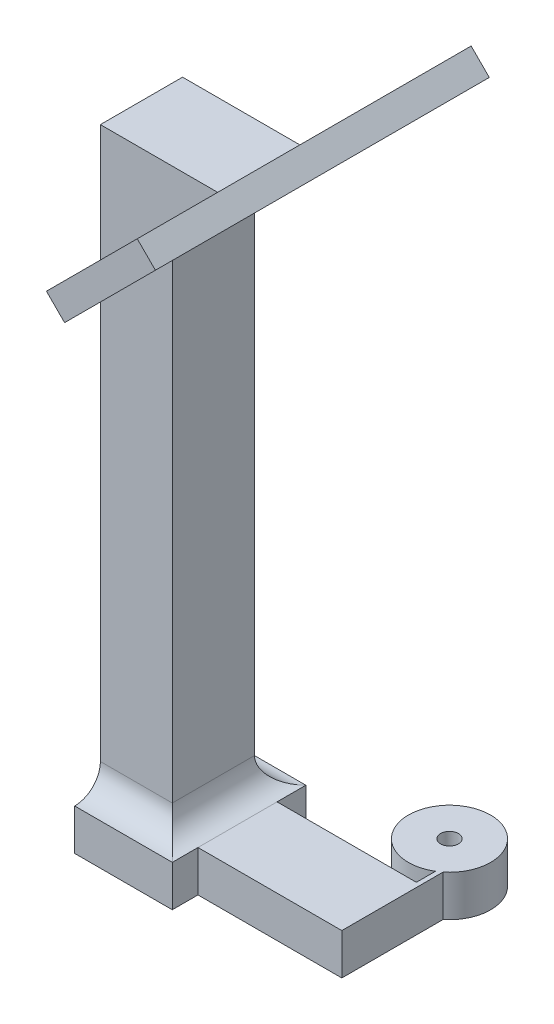
ISO-10303-21;
HEADER;
FILE_DESCRIPTION(('STEP AP214'),'2;1');
FILE_NAME('part.step','',(''),(''),'','','');
FILE_SCHEMA(('AUTOMOTIVE_DESIGN { 1 0 10303 214 1 1 1 1 }'));
ENDSEC;
DATA;
#1=APPLICATION_CONTEXT('core data for automotive mechanical design processes');
#2=APPLICATION_PROTOCOL_DEFINITION('international standard','automotive_design',2000,#1);
#3=PRODUCT_CONTEXT('',#1,'mechanical');
#4=PRODUCT('Part','Part','',(#3));
#5=PRODUCT_RELATED_PRODUCT_CATEGORY('part','',(#4));
#6=PRODUCT_DEFINITION_FORMATION('','',#4);
#7=PRODUCT_DEFINITION_CONTEXT('part definition',#1,'design');
#8=PRODUCT_DEFINITION('design','',#6,#7);
#9=PRODUCT_DEFINITION_SHAPE('','',#8);
#10=(LENGTH_UNIT() NAMED_UNIT(*) SI_UNIT(.MILLI.,.METRE.));
#11=(NAMED_UNIT(*) PLANE_ANGLE_UNIT() SI_UNIT($,.RADIAN.));
#12=(NAMED_UNIT(*) SI_UNIT($,.STERADIAN.) SOLID_ANGLE_UNIT());
#13=UNCERTAINTY_MEASURE_WITH_UNIT(LENGTH_MEASURE(1.E-05),#10,'distance_accuracy_value','');
#14=(GEOMETRIC_REPRESENTATION_CONTEXT(3) GLOBAL_UNCERTAINTY_ASSIGNED_CONTEXT((#13)) GLOBAL_UNIT_ASSIGNED_CONTEXT((#10,
#11,#12)) REPRESENTATION_CONTEXT('',''));
#15=CARTESIAN_POINT('',(0.,0.,0.));
#16=DIRECTION('',(0.,0.,1.));
#17=DIRECTION('',(1.,0.,0.));
#18=AXIS2_PLACEMENT_3D('',#15,#16,#17);
#19=CARTESIAN_POINT('',(-17.5355339059327,30.,-24.5));
#20=DIRECTION('',(0.,1.,0.));
#21=DIRECTION('',(0.,0.,1.));
#22=AXIS2_PLACEMENT_3D('',#19,#20,#21);
#23=PLANE('',#22);
#24=DIRECTION('',(0.,0.,1.));
#25=VECTOR('',#24,1.);
#26=CARTESIAN_POINT('',(-3.53553390593274,30.,-40.5));
#27=LINE('',#26,#25);
#28=CARTESIAN_POINT('',(-3.53553390593274,30.,-40.5));
#29=VERTEX_POINT('',#28);
#30=CARTESIAN_POINT('',(-3.53553390593274,30.,-24.5));
#31=VERTEX_POINT('',#30);
#32=EDGE_CURVE('E210',#29,#31,#27,.T.);
#33=ORIENTED_EDGE('',*,*,#32,.F.);
#34=DIRECTION('',(1.,0.,0.));
#35=VECTOR('',#34,1.);
#36=CARTESIAN_POINT('',(-17.5355339059327,30.,-40.5));
#37=LINE('',#36,#35);
#38=CARTESIAN_POINT('',(0.,30.,-40.5));
#39=VERTEX_POINT('',#38);
#40=EDGE_CURVE('E228',#29,#39,#37,.T.);
#41=ORIENTED_EDGE('',*,*,#40,.T.);
#42=DIRECTION('',(0.,0.,-1.));
#43=VECTOR('',#42,1.);
#44=CARTESIAN_POINT('',(0.,30.,-24.5));
#45=LINE('',#44,#43);
#46=CARTESIAN_POINT('',(0.,30.,-24.5));
#47=VERTEX_POINT('',#46);
#48=EDGE_CURVE('E251',#47,#39,#45,.T.);
#49=ORIENTED_EDGE('',*,*,#48,.F.);
#50=DIRECTION('',(1.,0.,0.));
#51=VECTOR('',#50,1.);
#52=CARTESIAN_POINT('',(-17.5355339059327,30.,-24.5));
#53=LINE('',#52,#51);
#54=EDGE_CURVE('E240',#31,#47,#53,.T.);
#55=ORIENTED_EDGE('',*,*,#54,.F.);
#56=EDGE_LOOP('',(#33,#41,#49,#55));
#57=FACE_BOUND('',#56,.T.);
#58=ADVANCED_FACE('F43',(#57),#23,.F.);
#59=CARTESIAN_POINT('',(-3.53553390593273,33.5355339059327,-65.));
#60=DIRECTION('',(-0.707106781186547,-0.707106781186548,0.));
#61=DIRECTION('',(0.707106781186548,-0.707106781186547,0.));
#62=AXIS2_PLACEMENT_3D('',#59,#60,#61);
#63=PLANE('',#62);
#64=DIRECTION('',(0.,0.,1.));
#65=VECTOR('',#64,1.);
#66=CARTESIAN_POINT('',(0.,30.,-65.));
#67=LINE('',#66,#65);
#68=CARTESIAN_POINT('',(0.,30.,-65.));
#69=VERTEX_POINT('',#68);
#70=EDGE_CURVE('E289',#69,#39,#67,.T.);
#71=ORIENTED_EDGE('',*,*,#70,.T.);
#72=DIRECTION('',(0.707106781186548,-0.707106781186547,0.));
#73=VECTOR('',#72,1.);
#74=CARTESIAN_POINT('',(-3.53553390593274,33.5355339059327,-40.5));
#75=LINE('',#74,#73);
#76=CARTESIAN_POINT('',(-3.53553390593274,33.5355339059327,-40.5));
#77=VERTEX_POINT('',#76);
#78=EDGE_CURVE('E230',#77,#39,#75,.T.);
#79=ORIENTED_EDGE('',*,*,#78,.F.);
#80=DIRECTION('',(0.,0.,1.));
#81=VECTOR('',#80,1.);
#82=CARTESIAN_POINT('',(-3.53553390593273,33.5355339059327,-65.));
#83=LINE('',#82,#81);
#84=CARTESIAN_POINT('',(-3.53553390593273,33.5355339059327,-65.));
#85=VERTEX_POINT('',#84);
#86=EDGE_CURVE('E294',#85,#77,#83,.T.);
#87=ORIENTED_EDGE('',*,*,#86,.F.);
#88=DIRECTION('',(0.707106781186548,-0.707106781186547,0.));
#89=VECTOR('',#88,1.);
#90=CARTESIAN_POINT('',(-3.53553390593273,33.5355339059327,-65.));
#91=LINE('',#90,#89);
#92=EDGE_CURVE('E275',#85,#69,#91,.T.);
#93=ORIENTED_EDGE('',*,*,#92,.T.);
#94=EDGE_LOOP('',(#71,#79,#87,#93));
#95=FACE_BOUND('',#94,.T.);
#96=ADVANCED_FACE('F392',(#95),#63,.T.);
#97=CARTESIAN_POINT('',(0.,30.,-65.));
#98=DIRECTION('',(0.707106781186547,-0.707106781186548,0.));
#99=DIRECTION('',(0.707106781186548,0.707106781186547,0.));
#100=AXIS2_PLACEMENT_3D('',#97,#98,#99);
#101=PLANE('',#100);
#102=CARTESIAN_POINT('',(8.83883476483185,38.8388347648318,-10.));
#103=DIRECTION('',(0.707106781186547,-0.707106781186548,0.));
#104=DIRECTION('',(0.707106781186548,0.707106781186547,0.));
#105=AXIS2_PLACEMENT_3D('',#102,#103,#104);
#106=CIRCLE('',#105,1.75);
#107=CARTESIAN_POINT('',(10.0762716319083,40.0762716319083,-10.));
#108=VERTEX_POINT('',#107);
#109=EDGE_CURVE('E261',#108,#108,#106,.T.);
#110=ORIENTED_EDGE('',*,*,#109,.F.);
#111=EDGE_LOOP('',(#110));
#112=FACE_BOUND('',#111,.T.);
#113=CARTESIAN_POINT('',(8.83883476483184,38.8388347648318,-55.));
#114=DIRECTION('',(0.707106781186547,-0.707106781186548,0.));
#115=DIRECTION('',(0.707106781186548,0.707106781186547,0.));
#116=AXIS2_PLACEMENT_3D('',#113,#114,#115);
#117=CIRCLE('',#116,1.75);
#118=CARTESIAN_POINT('',(10.0762716319083,40.0762716319083,-55.));
#119=VERTEX_POINT('',#118);
#120=EDGE_CURVE('E257',#119,#119,#117,.T.);
#121=ORIENTED_EDGE('',*,*,#120,.F.);
#122=EDGE_LOOP('',(#121));
#123=FACE_BOUND('',#122,.T.);
#124=DIRECTION('',(0.707106781186548,0.707106781186547,0.));
#125=VECTOR('',#124,1.);
#126=CARTESIAN_POINT('',(0.,30.,0.));
#127=LINE('',#126,#125);
#128=CARTESIAN_POINT('',(0.,30.,0.));
#129=VERTEX_POINT('',#128);
#130=CARTESIAN_POINT('',(17.6776695296637,47.6776695296637,0.));
#131=VERTEX_POINT('',#130);
#132=EDGE_CURVE('E264',#129,#131,#127,.T.);
#133=ORIENTED_EDGE('',*,*,#132,.F.);
#134=EDGE_CURVE('E293',#47,#129,#67,.T.);
#135=ORIENTED_EDGE('',*,*,#134,.F.);
#136=ORIENTED_EDGE('',*,*,#48,.T.);
#137=ORIENTED_EDGE('',*,*,#70,.F.);
#138=DIRECTION('',(0.707106781186548,0.707106781186547,0.));
#139=VECTOR('',#138,1.);
#140=CARTESIAN_POINT('',(0.,30.,-65.));
#141=LINE('',#140,#139);
#142=CARTESIAN_POINT('',(17.6776695296637,47.6776695296637,-65.));
#143=VERTEX_POINT('',#142);
#144=EDGE_CURVE('E265',#69,#143,#141,.T.);
#145=ORIENTED_EDGE('',*,*,#144,.T.);
#146=DIRECTION('',(0.,0.,1.));
#147=VECTOR('',#146,1.);
#148=CARTESIAN_POINT('',(17.6776695296637,47.6776695296637,-65.));
#149=LINE('',#148,#147);
#150=EDGE_CURVE('E278',#143,#131,#149,.T.);
#151=ORIENTED_EDGE('',*,*,#150,.T.);
#152=EDGE_LOOP('',(#133,#135,#136,#137,#145,#151));
#153=FACE_BOUND('',#152,.T.);
#154=ADVANCED_FACE('F397',(#112,#123,#153),#101,.T.);
#155=DIRECTION('',(0.707106781186548,-0.707106781186547,0.));
#156=VECTOR('',#155,1.);
#157=CARTESIAN_POINT('',(-3.53553390593274,33.5355339059327,-24.5));
#158=LINE('',#157,#156);
#159=CARTESIAN_POINT('',(-3.53553390593274,33.5355339059327,-24.5));
#160=VERTEX_POINT('',#159);
#161=EDGE_CURVE('E242',#160,#47,#158,.T.);
#162=ORIENTED_EDGE('',*,*,#161,.T.);
#163=ORIENTED_EDGE('',*,*,#134,.T.);
#164=DIRECTION('',(0.707106781186548,-0.707106781186547,0.));
#165=VECTOR('',#164,1.);
#166=CARTESIAN_POINT('',(-3.53553390593273,33.5355339059327,0.));
#167=LINE('',#166,#165);
#168=CARTESIAN_POINT('',(-3.53553390593273,33.5355339059327,0.));
#169=VERTEX_POINT('',#168);
#170=EDGE_CURVE('E269',#169,#129,#167,.T.);
#171=ORIENTED_EDGE('',*,*,#170,.F.);
#172=EDGE_CURVE('E297',#160,#169,#83,.T.);
#173=ORIENTED_EDGE('',*,*,#172,.F.);
#174=EDGE_LOOP('',(#162,#163,#171,#173));
#175=FACE_BOUND('',#174,.T.);
#176=ADVANCED_FACE('F413',(#175),#63,.T.);
#177=CARTESIAN_POINT('',(14.142135623731,51.2132034355964,-65.));
#178=DIRECTION('',(-0.707106781186547,0.707106781186547,0.));
#179=DIRECTION('',(-0.707106781186548,-0.707106781186548,0.));
#180=AXIS2_PLACEMENT_3D('',#177,#178,#179);
#181=PLANE('',#180);
#182=DIRECTION('',(-0.707106781186547,-0.707106781186548,0.));
#183=VECTOR('',#182,1.);
#184=CARTESIAN_POINT('',(5.30330085889909,42.3743686707646,-24.5));
#185=LINE('',#184,#183);
#186=CARTESIAN_POINT('',(5.30330085889909,42.3743686707646,-24.5));
#187=VERTEX_POINT('',#186);
#188=EDGE_CURVE('E245',#187,#160,#185,.T.);
#189=ORIENTED_EDGE('',*,*,#188,.T.);
#190=ORIENTED_EDGE('',*,*,#172,.T.);
#191=DIRECTION('',(-0.707106781186547,-0.707106781186547,0.));
#192=VECTOR('',#191,1.);
#193=CARTESIAN_POINT('',(14.142135623731,51.2132034355964,0.));
#194=LINE('',#193,#192);
#195=CARTESIAN_POINT('',(14.142135623731,51.2132034355964,0.));
#196=VERTEX_POINT('',#195);
#197=EDGE_CURVE('E284',#196,#169,#194,.T.);
#198=ORIENTED_EDGE('',*,*,#197,.F.);
#199=DIRECTION('',(0.,0.,1.));
#200=VECTOR('',#199,1.);
#201=CARTESIAN_POINT('',(14.142135623731,51.2132034355964,-65.));
#202=LINE('',#201,#200);
#203=CARTESIAN_POINT('',(14.142135623731,51.2132034355964,-65.));
#204=VERTEX_POINT('',#203);
#205=EDGE_CURVE('E298',#204,#196,#202,.T.);
#206=ORIENTED_EDGE('',*,*,#205,.F.);
#207=DIRECTION('',(-0.707106781186547,-0.707106781186547,0.));
#208=VECTOR('',#207,1.);
#209=CARTESIAN_POINT('',(14.142135623731,51.2132034355964,-65.));
#210=LINE('',#209,#208);
#211=EDGE_CURVE('E272',#204,#85,#210,.T.);
#212=ORIENTED_EDGE('',*,*,#211,.T.);
#213=ORIENTED_EDGE('',*,*,#86,.T.);
#214=DIRECTION('',(-0.707106781186547,-0.707106781186548,0.));
#215=VECTOR('',#214,1.);
#216=CARTESIAN_POINT('',(5.30330085889909,42.3743686707646,-40.5));
#217=LINE('',#216,#215);
#218=CARTESIAN_POINT('',(5.30330085889909,42.3743686707646,-40.5));
#219=VERTEX_POINT('',#218);
#220=EDGE_CURVE('E233',#219,#77,#217,.T.);
#221=ORIENTED_EDGE('',*,*,#220,.F.);
#222=DIRECTION('',(0.,0.,-1.));
#223=VECTOR('',#222,1.);
#224=CARTESIAN_POINT('',(5.30330085889909,42.3743686707646,-24.5));
#225=LINE('',#224,#223);
#226=EDGE_CURVE('E248',#187,#219,#225,.T.);
#227=ORIENTED_EDGE('',*,*,#226,.F.);
#228=EDGE_LOOP('',(#189,#190,#198,#206,#212,#213,#221,#227));
#229=FACE_BOUND('',#228,.T.);
#230=CARTESIAN_POINT('',(5.30330085889912,42.3743686707646,-10.));
#231=DIRECTION('',(-0.707106781186547,0.707106781186547,0.));
#232=DIRECTION('',(-0.707106781186548,-0.707106781186548,0.));
#233=AXIS2_PLACEMENT_3D('',#230,#231,#232);
#234=CIRCLE('',#233,1.75);
#235=CARTESIAN_POINT('',(4.06586399182266,41.1369318036881,-10.));
#236=VERTEX_POINT('',#235);
#237=EDGE_CURVE('E260',#236,#236,#234,.T.);
#238=ORIENTED_EDGE('',*,*,#237,.F.);
#239=EDGE_LOOP('',(#238));
#240=FACE_BOUND('',#239,.T.);
#241=CARTESIAN_POINT('',(5.3033008588991,42.3743686707646,-55.));
#242=DIRECTION('',(-0.707106781186547,0.707106781186547,0.));
#243=DIRECTION('',(-0.707106781186548,-0.707106781186548,0.));
#244=AXIS2_PLACEMENT_3D('',#241,#242,#243);
#245=CIRCLE('',#244,1.75);
#246=CARTESIAN_POINT('',(4.06586399182264,41.1369318036881,-55.));
#247=VERTEX_POINT('',#246);
#248=EDGE_CURVE('E256',#247,#247,#245,.T.);
#249=ORIENTED_EDGE('',*,*,#248,.F.);
#250=EDGE_LOOP('',(#249));
#251=FACE_BOUND('',#250,.T.);
#252=ADVANCED_FACE('F387',(#229,#240,#251),#181,.T.);
#253=CARTESIAN_POINT('',(17.6776695296637,47.6776695296637,-65.));
#254=DIRECTION('',(0.707106781186549,0.707106781186546,0.));
#255=DIRECTION('',(-0.707106781186546,0.707106781186549,0.));
#256=AXIS2_PLACEMENT_3D('',#253,#254,#255);
#257=PLANE('',#256);
#258=DIRECTION('',(-0.707106781186546,0.707106781186549,0.));
#259=VECTOR('',#258,1.);
#260=CARTESIAN_POINT('',(17.6776695296637,47.6776695296637,0.));
#261=LINE('',#260,#259);
#262=EDGE_CURVE('E281',#131,#196,#261,.T.);
#263=ORIENTED_EDGE('',*,*,#262,.F.);
#264=ORIENTED_EDGE('',*,*,#150,.F.);
#265=DIRECTION('',(-0.707106781186546,0.707106781186549,0.));
#266=VECTOR('',#265,1.);
#267=CARTESIAN_POINT('',(17.6776695296637,47.6776695296637,-65.));
#268=LINE('',#267,#266);
#269=EDGE_CURVE('E268',#143,#204,#268,.T.);
#270=ORIENTED_EDGE('',*,*,#269,.T.);
#271=ORIENTED_EDGE('',*,*,#205,.T.);
#272=EDGE_LOOP('',(#263,#264,#270,#271));
#273=FACE_BOUND('',#272,.T.);
#274=ADVANCED_FACE('F406',(#273),#257,.T.);
#275=CARTESIAN_POINT('',(0.,0.,-65.));
#276=DIRECTION('',(0.,0.,1.));
#277=DIRECTION('',(1.,0.,0.));
#278=AXIS2_PLACEMENT_3D('',#275,#276,#277);
#279=PLANE('',#278);
#280=ORIENTED_EDGE('',*,*,#144,.F.);
#281=ORIENTED_EDGE('',*,*,#92,.F.);
#282=ORIENTED_EDGE('',*,*,#211,.F.);
#283=ORIENTED_EDGE('',*,*,#269,.F.);
#284=EDGE_LOOP('',(#280,#281,#282,#283));
#285=FACE_BOUND('',#284,.T.);
#286=ADVANCED_FACE('F402',(#285),#279,.F.);
#287=CARTESIAN_POINT('',(0.,0.,0.));
#288=DIRECTION('',(0.,0.,1.));
#289=DIRECTION('',(1.,0.,0.));
#290=AXIS2_PLACEMENT_3D('',#287,#288,#289);
#291=PLANE('',#290);
#292=ORIENTED_EDGE('',*,*,#132,.T.);
#293=ORIENTED_EDGE('',*,*,#262,.T.);
#294=ORIENTED_EDGE('',*,*,#197,.T.);
#295=ORIENTED_EDGE('',*,*,#170,.T.);
#296=EDGE_LOOP('',(#292,#293,#294,#295));
#297=FACE_BOUND('',#296,.T.);
#298=ADVANCED_FACE('F410',(#297),#291,.T.);
#299=CARTESIAN_POINT('',(17.6776695296637,30.,-55.));
#300=DIRECTION('',(-0.707106781186548,0.707106781186547,0.));
#301=DIRECTION('',(-0.707106781186547,-0.707106781186548,0.));
#302=AXIS2_PLACEMENT_3D('',#299,#300,#301);
#303=CYLINDRICAL_SURFACE('',#302,1.75);
#304=ORIENTED_EDGE('',*,*,#120,.T.);
#305=EDGE_LOOP('',(#304));
#306=FACE_BOUND('',#305,.T.);
#307=ORIENTED_EDGE('',*,*,#248,.T.);
#308=EDGE_LOOP('',(#307));
#309=FACE_BOUND('',#308,.T.);
#310=ADVANCED_FACE('F488',(#306,#309),#303,.F.);
#311=CARTESIAN_POINT('',(17.6776695296637,30.,-10.));
#312=DIRECTION('',(-0.707106781186548,0.707106781186547,0.));
#313=DIRECTION('',(-0.707106781186547,-0.707106781186548,0.));
#314=AXIS2_PLACEMENT_3D('',#311,#312,#313);
#315=CYLINDRICAL_SURFACE('',#314,1.75);
#316=ORIENTED_EDGE('',*,*,#109,.T.);
#317=EDGE_LOOP('',(#316));
#318=FACE_BOUND('',#317,.T.);
#319=ORIENTED_EDGE('',*,*,#237,.T.);
#320=EDGE_LOOP('',(#319));
#321=FACE_BOUND('',#320,.T.);
#322=ADVANCED_FACE('F485',(#318,#321),#315,.F.);
#323=CARTESIAN_POINT('',(5.30330085889909,42.3743686707646,-24.5));
#324=DIRECTION('',(0.,-1.,0.));
#325=DIRECTION('',(0.,0.,-1.));
#326=AXIS2_PLACEMENT_3D('',#323,#324,#325);
#327=PLANE('',#326);
#328=ORIENTED_EDGE('',*,*,#226,.T.);
#329=DIRECTION('',(-1.,0.,0.));
#330=VECTOR('',#329,1.);
#331=CARTESIAN_POINT('',(5.30330085889909,42.3743686707646,-40.5));
#332=LINE('',#331,#330);
#333=CARTESIAN_POINT('',(-17.5355339059327,42.3743686707646,-40.5));
#334=VERTEX_POINT('',#333);
#335=EDGE_CURVE('E222',#219,#334,#332,.T.);
#336=ORIENTED_EDGE('',*,*,#335,.T.);
#337=DIRECTION('',(0.,0.,-1.));
#338=VECTOR('',#337,1.);
#339=CARTESIAN_POINT('',(-17.5355339059327,42.3743686707646,-24.5));
#340=LINE('',#339,#338);
#341=CARTESIAN_POINT('',(-17.5355339059327,42.3743686707646,-24.5));
#342=VERTEX_POINT('',#341);
#343=EDGE_CURVE('E254',#342,#334,#340,.T.);
#344=ORIENTED_EDGE('',*,*,#343,.F.);
#345=DIRECTION('',(-1.,0.,0.));
#346=VECTOR('',#345,1.);
#347=CARTESIAN_POINT('',(5.30330085889909,42.3743686707646,-24.5));
#348=LINE('',#347,#346);
#349=EDGE_CURVE('E235',#187,#342,#348,.T.);
#350=ORIENTED_EDGE('',*,*,#349,.F.);
#351=EDGE_LOOP('',(#328,#336,#344,#350));
#352=FACE_BOUND('',#351,.T.);
#353=ADVANCED_FACE('F382',(#352),#327,.F.);
#354=CARTESIAN_POINT('',(-17.5355339059327,42.3743686707646,-24.5));
#355=DIRECTION('',(1.,0.,0.));
#356=DIRECTION('',(0.,1.,0.));
#357=AXIS2_PLACEMENT_3D('',#354,#355,#356);
#358=PLANE('',#357);
#359=ORIENTED_EDGE('',*,*,#343,.T.);
#360=DIRECTION('',(0.,-1.,0.));
#361=VECTOR('',#360,1.);
#362=CARTESIAN_POINT('',(-17.5355339059327,42.3743686707646,-40.5));
#363=LINE('',#362,#361);
#364=CARTESIAN_POINT('',(-17.5355339059328,-65.,-40.5));
#365=VERTEX_POINT('',#364);
#366=EDGE_CURVE('E225',#334,#365,#363,.T.);
#367=ORIENTED_EDGE('',*,*,#366,.T.);
#368=CARTESIAN_POINT('',(-17.5355339059328,-65.,-45.5));
#369=DIRECTION('',(1.,0.,0.));
#370=DIRECTION('',(0.,1.,0.));
#371=AXIS2_PLACEMENT_3D('',#368,#369,#370);
#372=CIRCLE('',#371,5.);
#373=CARTESIAN_POINT('',(-17.5355339059327,-70.,-45.5));
#374=VERTEX_POINT('',#373);
#375=EDGE_CURVE('E52',#365,#374,#372,.T.);
#376=ORIENTED_EDGE('',*,*,#375,.T.);
#377=DIRECTION('',(0.,1.,0.));
#378=VECTOR('',#377,1.);
#379=CARTESIAN_POINT('',(-17.5355339059327,-78.,-45.5));
#380=LINE('',#379,#378);
#381=CARTESIAN_POINT('',(-17.5355339059327,-78.,-45.5));
#382=VERTEX_POINT('',#381);
#383=EDGE_CURVE('E191',#382,#374,#380,.T.);
#384=ORIENTED_EDGE('',*,*,#383,.F.);
#385=DIRECTION('',(0.,0.,-1.));
#386=VECTOR('',#385,1.);
#387=CARTESIAN_POINT('',(-17.5355339059327,-78.,0.));
#388=LINE('',#387,#386);
#389=CARTESIAN_POINT('',(-17.5355339059327,-78.,-19.5));
#390=VERTEX_POINT('',#389);
#391=EDGE_CURVE('E184',#390,#382,#388,.T.);
#392=ORIENTED_EDGE('',*,*,#391,.F.);
#393=DIRECTION('',(0.,1.,0.));
#394=VECTOR('',#393,1.);
#395=CARTESIAN_POINT('',(-17.5355339059327,-78.,-19.5));
#396=LINE('',#395,#394);
#397=CARTESIAN_POINT('',(-17.5355339059327,-70.,-19.5));
#398=VERTEX_POINT('',#397);
#399=EDGE_CURVE('E188',#390,#398,#396,.T.);
#400=ORIENTED_EDGE('',*,*,#399,.T.);
#401=CARTESIAN_POINT('',(-17.5355339059328,-65.,-19.5));
#402=DIRECTION('',(1.,0.,0.));
#403=DIRECTION('',(0.,1.,0.));
#404=AXIS2_PLACEMENT_3D('',#401,#402,#403);
#405=CIRCLE('',#404,5.);
#406=CARTESIAN_POINT('',(-17.5355339059328,-65.,-24.5));
#407=VERTEX_POINT('',#406);
#408=EDGE_CURVE('E11',#398,#407,#405,.T.);
#409=ORIENTED_EDGE('',*,*,#408,.T.);
#410=DIRECTION('',(0.,-1.,0.));
#411=VECTOR('',#410,1.);
#412=CARTESIAN_POINT('',(-17.5355339059327,42.3743686707646,-24.5));
#413=LINE('',#412,#411);
#414=EDGE_CURVE('E238',#342,#407,#413,.T.);
#415=ORIENTED_EDGE('',*,*,#414,.F.);
#416=EDGE_LOOP('',(#359,#367,#376,#384,#392,#400,#409,#415));
#417=FACE_BOUND('',#416,.T.);
#418=ADVANCED_FACE('F186',(#417),#358,.F.);
#419=CARTESIAN_POINT('',(0.,0.,-24.5));
#420=DIRECTION('',(0.,0.,1.));
#421=DIRECTION('',(1.,0.,0.));
#422=AXIS2_PLACEMENT_3D('',#419,#420,#421);
#423=PLANE('',#422);
#424=ORIENTED_EDGE('',*,*,#414,.T.);
#425=DIRECTION('',(-1.,0.,0.));
#426=VECTOR('',#425,1.);
#427=CARTESIAN_POINT('',(0.,-65.,-24.5));
#428=LINE('',#427,#426);
#429=CARTESIAN_POINT('',(-3.53553390593274,-65.,-24.5));
#430=VERTEX_POINT('',#429);
#431=EDGE_CURVE('E60',#407,#430,#428,.F.);
#432=ORIENTED_EDGE('',*,*,#431,.T.);
#433=DIRECTION('',(0.,1.,0.));
#434=VECTOR('',#433,1.);
#435=CARTESIAN_POINT('',(-3.53553390593274,-70.,-24.5));
#436=LINE('',#435,#434);
#437=EDGE_CURVE('E213',#430,#31,#436,.T.);
#438=ORIENTED_EDGE('',*,*,#437,.T.);
#439=ORIENTED_EDGE('',*,*,#54,.T.);
#440=ORIENTED_EDGE('',*,*,#161,.F.);
#441=ORIENTED_EDGE('',*,*,#188,.F.);
#442=ORIENTED_EDGE('',*,*,#349,.T.);
#443=EDGE_LOOP('',(#424,#432,#438,#439,#440,#441,#442));
#444=FACE_BOUND('',#443,.T.);
#445=ADVANCED_FACE('F414',(#444),#423,.T.);
#446=CARTESIAN_POINT('',(0.,0.,-40.5));
#447=DIRECTION('',(0.,0.,1.));
#448=DIRECTION('',(1.,0.,0.));
#449=AXIS2_PLACEMENT_3D('',#446,#447,#448);
#450=PLANE('',#449);
#451=DIRECTION('',(0.,1.,0.));
#452=VECTOR('',#451,1.);
#453=CARTESIAN_POINT('',(-3.53553390593274,-70.,-40.5));
#454=LINE('',#453,#452);
#455=CARTESIAN_POINT('',(-3.53553390593274,-65.,-40.5));
#456=VERTEX_POINT('',#455);
#457=EDGE_CURVE('E220',#456,#29,#454,.T.);
#458=ORIENTED_EDGE('',*,*,#457,.F.);
#459=DIRECTION('',(1.,0.,0.));
#460=VECTOR('',#459,1.);
#461=CARTESIAN_POINT('',(-17.5355339059327,-65.,-40.5));
#462=LINE('',#461,#460);
#463=EDGE_CURVE('E306',#456,#365,#462,.F.);
#464=ORIENTED_EDGE('',*,*,#463,.T.);
#465=ORIENTED_EDGE('',*,*,#366,.F.);
#466=ORIENTED_EDGE('',*,*,#335,.F.);
#467=ORIENTED_EDGE('',*,*,#220,.T.);
#468=ORIENTED_EDGE('',*,*,#78,.T.);
#469=ORIENTED_EDGE('',*,*,#40,.F.);
#470=EDGE_LOOP('',(#458,#464,#465,#466,#467,#468,#469));
#471=FACE_BOUND('',#470,.T.);
#472=ADVANCED_FACE('F380',(#471),#450,.F.);
#473=CARTESIAN_POINT('',(-3.53553390593274,-70.,-40.5));
#474=DIRECTION('',(-1.,0.,0.));
#475=DIRECTION('',(0.,0.,1.));
#476=AXIS2_PLACEMENT_3D('',#473,#474,#475);
#477=PLANE('',#476);
#478=ORIENTED_EDGE('',*,*,#437,.F.);
#479=DIRECTION('',(0.,0.,1.));
#480=VECTOR('',#479,1.);
#481=CARTESIAN_POINT('',(-3.53553390593274,-65.,-40.5));
#482=LINE('',#481,#480);
#483=EDGE_CURVE('E309',#430,#456,#482,.F.);
#484=ORIENTED_EDGE('',*,*,#483,.T.);
#485=ORIENTED_EDGE('',*,*,#457,.T.);
#486=ORIENTED_EDGE('',*,*,#32,.T.);
#487=EDGE_LOOP('',(#478,#484,#485,#486));
#488=FACE_BOUND('',#487,.T.);
#489=ADVANCED_FACE('F419',(#488),#477,.F.);
#490=CARTESIAN_POINT('',(0.,-70.,0.));
#491=DIRECTION('',(0.,-1.,0.));
#492=DIRECTION('',(0.,0.,-1.));
#493=AXIS2_PLACEMENT_3D('',#490,#491,#492);
#494=PLANE('',#493);
#495=CARTESIAN_POINT('',(24.4658946290548,-70.,-50.4623935367041));
#496=DIRECTION('',(0.,-1.,0.));
#497=DIRECTION('',(0.,0.,-1.));
#498=AXIS2_PLACEMENT_3D('',#495,#496,#497);
#499=CIRCLE('',#498,1.75);
#500=CARTESIAN_POINT('',(24.4658946290548,-70.,-52.2123935367041));
#501=VERTEX_POINT('',#500);
#502=EDGE_CURVE('E205',#501,#501,#499,.T.);
#503=ORIENTED_EDGE('',*,*,#502,.T.);
#504=EDGE_LOOP('',(#503));
#505=FACE_BOUND('',#504,.T.);
#506=DIRECTION('',(1.,0.,0.));
#507=VECTOR('',#506,1.);
#508=CARTESIAN_POINT('',(0.,-70.,-39.88952868371));
#509=LINE('',#508,#507);
#510=CARTESIAN_POINT('',(1.46446609406726,-70.,-39.88952868371));
#511=VERTEX_POINT('',#510);
#512=CARTESIAN_POINT('',(28.5893083210539,-70.,-39.88952868371));
#513=VERTEX_POINT('',#512);
#514=EDGE_CURVE('E332',#511,#513,#509,.T.);
#515=ORIENTED_EDGE('',*,*,#514,.F.);
#516=DIRECTION('',(0.,0.,1.));
#517=VECTOR('',#516,1.);
#518=CARTESIAN_POINT('',(1.46446609406726,-70.,-24.5));
#519=LINE('',#518,#517);
#520=CARTESIAN_POINT('',(1.46446609406726,-70.,-24.5));
#521=VERTEX_POINT('',#520);
#522=EDGE_CURVE('E292',#511,#521,#519,.T.);
#523=ORIENTED_EDGE('',*,*,#522,.T.);
#524=DIRECTION('',(-1.,0.,0.));
#525=VECTOR('',#524,1.);
#526=CARTESIAN_POINT('',(0.,-70.,-24.5));
#527=LINE('',#526,#525);
#528=CARTESIAN_POINT('',(29.4658946290548,-70.,-24.5));
#529=VERTEX_POINT('',#528);
#530=EDGE_CURVE('E343',#529,#521,#527,.T.);
#531=ORIENTED_EDGE('',*,*,#530,.F.);
#532=DIRECTION('',(0.,0.,-1.));
#533=VECTOR('',#532,1.);
#534=CARTESIAN_POINT('',(29.4658946290548,-70.,0.));
#535=LINE('',#534,#533);
#536=CARTESIAN_POINT('',(29.4658946290548,-70.,-44.2173955383057));
#537=VERTEX_POINT('',#536);
#538=EDGE_CURVE('E340',#529,#537,#535,.T.);
#539=ORIENTED_EDGE('',*,*,#538,.T.);
#540=CARTESIAN_POINT('',(24.4658946290548,-70.,-50.4623935367041));
#541=DIRECTION('',(0.,-1.,0.));
#542=DIRECTION('',(0.,0.,-1.));
#543=AXIS2_PLACEMENT_3D('',#540,#541,#542);
#544=CIRCLE('',#543,8.);
#545=CARTESIAN_POINT('',(28.5893083210539,-70.,-43.6069242220157));
#546=VERTEX_POINT('',#545);
#547=EDGE_CURVE('E337',#546,#537,#544,.T.);
#548=ORIENTED_EDGE('',*,*,#547,.F.);
#549=DIRECTION('',(0.,0.,-1.));
#550=VECTOR('',#549,1.);
#551=CARTESIAN_POINT('',(28.5893083210539,-70.,0.));
#552=LINE('',#551,#550);
#553=EDGE_CURVE('E335',#513,#546,#552,.T.);
#554=ORIENTED_EDGE('',*,*,#553,.F.);
#555=EDGE_LOOP('',(#515,#523,#531,#539,#548,#554));
#556=FACE_BOUND('',#555,.T.);
#557=ADVANCED_FACE('F425',(#505,#556),#494,.F.);
#558=CARTESIAN_POINT('',(0.,-78.,-19.5));
#559=DIRECTION('',(0.,0.,-1.));
#560=DIRECTION('',(-1.,0.,0.));
#561=AXIS2_PLACEMENT_3D('',#558,#559,#560);
#562=PLANE('',#561);
#563=DIRECTION('',(-1.,0.,0.));
#564=VECTOR('',#563,1.);
#565=CARTESIAN_POINT('',(0.,-70.,-19.5));
#566=LINE('',#565,#564);
#567=CARTESIAN_POINT('',(1.46446609406726,-70.,-19.5));
#568=VERTEX_POINT('',#567);
#569=EDGE_CURVE('E209',#568,#398,#566,.T.);
#570=ORIENTED_EDGE('',*,*,#569,.T.);
#571=ORIENTED_EDGE('',*,*,#399,.F.);
#572=DIRECTION('',(-1.,0.,0.));
#573=VECTOR('',#572,1.);
#574=CARTESIAN_POINT('',(0.,-78.,-19.5));
#575=LINE('',#574,#573);
#576=CARTESIAN_POINT('',(1.46446609406726,-78.,-19.5));
#577=VERTEX_POINT('',#576);
#578=EDGE_CURVE('E195',#577,#390,#575,.T.);
#579=ORIENTED_EDGE('',*,*,#578,.F.);
#580=DIRECTION('',(0.,1.,0.));
#581=VECTOR('',#580,1.);
#582=CARTESIAN_POINT('',(1.46446609406726,-78.,-19.5));
#583=LINE('',#582,#581);
#584=EDGE_CURVE('E348',#577,#568,#583,.T.);
#585=ORIENTED_EDGE('',*,*,#584,.T.);
#586=EDGE_LOOP('',(#570,#571,#579,#585));
#587=FACE_BOUND('',#586,.T.);
#588=ADVANCED_FACE('F207',(#587),#562,.F.);
#589=CARTESIAN_POINT('',(0.,-78.,-45.5));
#590=DIRECTION('',(0.,0.,1.));
#591=DIRECTION('',(1.,0.,0.));
#592=AXIS2_PLACEMENT_3D('',#589,#590,#591);
#593=PLANE('',#592);
#594=DIRECTION('',(1.,0.,0.));
#595=VECTOR('',#594,1.);
#596=CARTESIAN_POINT('',(0.,-70.,-45.5));
#597=LINE('',#596,#595);
#598=CARTESIAN_POINT('',(1.46446609406726,-70.,-45.5));
#599=VERTEX_POINT('',#598);
#600=EDGE_CURVE('E322',#374,#599,#597,.T.);
#601=ORIENTED_EDGE('',*,*,#600,.T.);
#602=DIRECTION('',(0.,1.,0.));
#603=VECTOR('',#602,1.);
#604=CARTESIAN_POINT('',(1.46446609406726,-78.,-45.5));
#605=LINE('',#604,#603);
#606=CARTESIAN_POINT('',(1.46446609406726,-78.,-45.5));
#607=VERTEX_POINT('',#606);
#608=EDGE_CURVE('E215',#607,#599,#605,.T.);
#609=ORIENTED_EDGE('',*,*,#608,.F.);
#610=DIRECTION('',(1.,0.,0.));
#611=VECTOR('',#610,1.);
#612=CARTESIAN_POINT('',(0.,-78.,-45.5));
#613=LINE('',#612,#611);
#614=EDGE_CURVE('E194',#382,#607,#613,.T.);
#615=ORIENTED_EDGE('',*,*,#614,.F.);
#616=ORIENTED_EDGE('',*,*,#383,.T.);
#617=EDGE_LOOP('',(#601,#609,#615,#616));
#618=FACE_BOUND('',#617,.T.);
#619=ADVANCED_FACE('F373',(#618),#593,.F.);
#620=CARTESIAN_POINT('',(1.46446609406726,-78.,0.));
#621=DIRECTION('',(-1.,0.,0.));
#622=DIRECTION('',(0.,0.,1.));
#623=AXIS2_PLACEMENT_3D('',#620,#621,#622);
#624=PLANE('',#623);
#625=DIRECTION('',(0.,0.,1.));
#626=VECTOR('',#625,1.);
#627=CARTESIAN_POINT('',(1.46446609406726,-70.,0.));
#628=LINE('',#627,#626);
#629=EDGE_CURVE('E325',#599,#511,#628,.T.);
#630=ORIENTED_EDGE('',*,*,#629,.T.);
#631=DIRECTION('',(0.,1.,0.));
#632=VECTOR('',#631,1.);
#633=CARTESIAN_POINT('',(1.46446609406726,-78.,-39.88952868371));
#634=LINE('',#633,#632);
#635=CARTESIAN_POINT('',(1.46446609406726,-78.,-39.88952868371));
#636=VERTEX_POINT('',#635);
#637=EDGE_CURVE('E363',#636,#511,#634,.T.);
#638=ORIENTED_EDGE('',*,*,#637,.F.);
#639=DIRECTION('',(0.,0.,1.));
#640=VECTOR('',#639,1.);
#641=CARTESIAN_POINT('',(1.46446609406726,-78.,0.));
#642=LINE('',#641,#640);
#643=EDGE_CURVE('E371',#607,#636,#642,.T.);
#644=ORIENTED_EDGE('',*,*,#643,.F.);
#645=ORIENTED_EDGE('',*,*,#608,.T.);
#646=EDGE_LOOP('',(#630,#638,#644,#645));
#647=FACE_BOUND('',#646,.T.);
#648=ADVANCED_FACE('F369',(#647),#624,.F.);
#649=CARTESIAN_POINT('',(0.,-78.,-39.88952868371));
#650=DIRECTION('',(0.,0.,1.));
#651=DIRECTION('',(1.,0.,0.));
#652=AXIS2_PLACEMENT_3D('',#649,#650,#651);
#653=PLANE('',#652);
#654=ORIENTED_EDGE('',*,*,#514,.T.);
#655=DIRECTION('',(0.,1.,0.));
#656=VECTOR('',#655,1.);
#657=CARTESIAN_POINT('',(28.5893083210539,-78.,-39.88952868371));
#658=LINE('',#657,#656);
#659=CARTESIAN_POINT('',(28.5893083210539,-78.,-39.88952868371));
#660=VERTEX_POINT('',#659);
#661=EDGE_CURVE('E360',#660,#513,#658,.T.);
#662=ORIENTED_EDGE('',*,*,#661,.F.);
#663=DIRECTION('',(1.,0.,0.));
#664=VECTOR('',#663,1.);
#665=CARTESIAN_POINT('',(0.,-78.,-39.88952868371));
#666=LINE('',#665,#664);
#667=EDGE_CURVE('E440',#636,#660,#666,.T.);
#668=ORIENTED_EDGE('',*,*,#667,.F.);
#669=ORIENTED_EDGE('',*,*,#637,.T.);
#670=EDGE_LOOP('',(#654,#662,#668,#669));
#671=FACE_BOUND('',#670,.T.);
#672=ADVANCED_FACE('F462',(#671),#653,.F.);
#673=CARTESIAN_POINT('',(28.5893083210539,-78.,0.));
#674=DIRECTION('',(1.,0.,0.));
#675=DIRECTION('',(0.,0.,-1.));
#676=AXIS2_PLACEMENT_3D('',#673,#674,#675);
#677=PLANE('',#676);
#678=ORIENTED_EDGE('',*,*,#553,.T.);
#679=DIRECTION('',(0.,1.,0.));
#680=VECTOR('',#679,1.);
#681=CARTESIAN_POINT('',(28.5893083210539,-78.,-43.6069242220157));
#682=LINE('',#681,#680);
#683=CARTESIAN_POINT('',(28.5893083210539,-78.,-43.6069242220157));
#684=VERTEX_POINT('',#683);
#685=EDGE_CURVE('E357',#684,#546,#682,.T.);
#686=ORIENTED_EDGE('',*,*,#685,.F.);
#687=DIRECTION('',(0.,0.,-1.));
#688=VECTOR('',#687,1.);
#689=CARTESIAN_POINT('',(28.5893083210539,-78.,0.));
#690=LINE('',#689,#688);
#691=EDGE_CURVE('E441',#660,#684,#690,.T.);
#692=ORIENTED_EDGE('',*,*,#691,.F.);
#693=ORIENTED_EDGE('',*,*,#661,.T.);
#694=EDGE_LOOP('',(#678,#686,#692,#693));
#695=FACE_BOUND('',#694,.T.);
#696=ADVANCED_FACE('F460',(#695),#677,.F.);
#697=CARTESIAN_POINT('',(24.4658946290548,-78.,-50.4623935367041));
#698=DIRECTION('',(0.,1.,0.));
#699=DIRECTION('',(0.,0.,1.));
#700=AXIS2_PLACEMENT_3D('',#697,#698,#699);
#701=CYLINDRICAL_SURFACE('',#700,8.);
#702=ORIENTED_EDGE('',*,*,#547,.T.);
#703=DIRECTION('',(0.,1.,0.));
#704=VECTOR('',#703,1.);
#705=CARTESIAN_POINT('',(29.4658946290548,-78.,-44.2173955383057));
#706=LINE('',#705,#704);
#707=CARTESIAN_POINT('',(29.4658946290548,-78.,-44.2173955383057));
#708=VERTEX_POINT('',#707);
#709=EDGE_CURVE('E355',#708,#537,#706,.T.);
#710=ORIENTED_EDGE('',*,*,#709,.F.);
#711=CARTESIAN_POINT('',(24.4658946290548,-78.,-50.4623935367041));
#712=DIRECTION('',(0.,-1.,0.));
#713=DIRECTION('',(0.,0.,-1.));
#714=AXIS2_PLACEMENT_3D('',#711,#712,#713);
#715=CIRCLE('',#714,8.);
#716=EDGE_CURVE('E444',#684,#708,#715,.T.);
#717=ORIENTED_EDGE('',*,*,#716,.F.);
#718=ORIENTED_EDGE('',*,*,#685,.T.);
#719=EDGE_LOOP('',(#702,#710,#717,#718));
#720=FACE_BOUND('',#719,.T.);
#721=ADVANCED_FACE('F457',(#720),#701,.T.);
#722=CARTESIAN_POINT('',(29.4658946290548,-78.,0.));
#723=DIRECTION('',(1.,0.,0.));
#724=DIRECTION('',(0.,0.,-1.));
#725=AXIS2_PLACEMENT_3D('',#722,#723,#724);
#726=PLANE('',#725);
#727=ORIENTED_EDGE('',*,*,#538,.F.);
#728=DIRECTION('',(0.,1.,0.));
#729=VECTOR('',#728,1.);
#730=CARTESIAN_POINT('',(29.4658946290548,-78.,-24.5));
#731=LINE('',#730,#729);
#732=CARTESIAN_POINT('',(29.4658946290548,-78.,-24.5));
#733=VERTEX_POINT('',#732);
#734=EDGE_CURVE('E353',#733,#529,#731,.T.);
#735=ORIENTED_EDGE('',*,*,#734,.F.);
#736=DIRECTION('',(0.,0.,-1.));
#737=VECTOR('',#736,1.);
#738=CARTESIAN_POINT('',(29.4658946290548,-78.,0.));
#739=LINE('',#738,#737);
#740=EDGE_CURVE('E437',#733,#708,#739,.T.);
#741=ORIENTED_EDGE('',*,*,#740,.T.);
#742=ORIENTED_EDGE('',*,*,#709,.T.);
#743=EDGE_LOOP('',(#727,#735,#741,#742));
#744=FACE_BOUND('',#743,.T.);
#745=ADVANCED_FACE('F451',(#744),#726,.T.);
#746=CARTESIAN_POINT('',(0.,-78.,-24.5));
#747=DIRECTION('',(0.,0.,-1.));
#748=DIRECTION('',(-1.,0.,0.));
#749=AXIS2_PLACEMENT_3D('',#746,#747,#748);
#750=PLANE('',#749);
#751=ORIENTED_EDGE('',*,*,#530,.T.);
#752=DIRECTION('',(0.,1.,0.));
#753=VECTOR('',#752,1.);
#754=CARTESIAN_POINT('',(1.46446609406726,-78.,-24.5));
#755=LINE('',#754,#753);
#756=CARTESIAN_POINT('',(1.46446609406726,-78.,-24.5));
#757=VERTEX_POINT('',#756);
#758=EDGE_CURVE('E350',#757,#521,#755,.T.);
#759=ORIENTED_EDGE('',*,*,#758,.F.);
#760=DIRECTION('',(-1.,0.,0.));
#761=VECTOR('',#760,1.);
#762=CARTESIAN_POINT('',(0.,-78.,-24.5));
#763=LINE('',#762,#761);
#764=EDGE_CURVE('E434',#733,#757,#763,.T.);
#765=ORIENTED_EDGE('',*,*,#764,.F.);
#766=ORIENTED_EDGE('',*,*,#734,.T.);
#767=EDGE_LOOP('',(#751,#759,#765,#766));
#768=FACE_BOUND('',#767,.T.);
#769=ADVANCED_FACE('F430',(#768),#750,.F.);
#770=EDGE_CURVE('E333',#521,#568,#628,.T.);
#771=ORIENTED_EDGE('',*,*,#770,.T.);
#772=ORIENTED_EDGE('',*,*,#584,.F.);
#773=EDGE_CURVE('E201',#757,#577,#642,.T.);
#774=ORIENTED_EDGE('',*,*,#773,.F.);
#775=ORIENTED_EDGE('',*,*,#758,.T.);
#776=EDGE_LOOP('',(#771,#772,#774,#775));
#777=FACE_BOUND('',#776,.T.);
#778=ADVANCED_FACE('F433',(#777),#624,.F.);
#779=CARTESIAN_POINT('',(24.4658946290548,-78.,-50.4623935367041));
#780=DIRECTION('',(0.,1.,0.));
#781=DIRECTION('',(0.,0.,1.));
#782=AXIS2_PLACEMENT_3D('',#779,#780,#781);
#783=CYLINDRICAL_SURFACE('',#782,1.75);
#784=CARTESIAN_POINT('',(24.4658946290548,-78.,-50.4623935367041));
#785=DIRECTION('',(0.,-1.,0.));
#786=DIRECTION('',(0.,0.,-1.));
#787=AXIS2_PLACEMENT_3D('',#784,#785,#786);
#788=CIRCLE('',#787,1.75);
#789=CARTESIAN_POINT('',(24.4658946290548,-78.,-52.2123935367041));
#790=VERTEX_POINT('',#789);
#791=EDGE_CURVE('E328',#790,#790,#788,.T.);
#792=ORIENTED_EDGE('',*,*,#791,.T.);
#793=EDGE_LOOP('',(#792));
#794=FACE_BOUND('',#793,.T.);
#795=ORIENTED_EDGE('',*,*,#502,.F.);
#796=EDGE_LOOP('',(#795));
#797=FACE_BOUND('',#796,.T.);
#798=ADVANCED_FACE('F514',(#794,#797),#783,.F.);
#799=CARTESIAN_POINT('',(0.,-78.,0.));
#800=DIRECTION('',(0.,-1.,0.));
#801=DIRECTION('',(0.,0.,-1.));
#802=AXIS2_PLACEMENT_3D('',#799,#800,#801);
#803=PLANE('',#802);
#804=ORIENTED_EDGE('',*,*,#578,.T.);
#805=ORIENTED_EDGE('',*,*,#391,.T.);
#806=ORIENTED_EDGE('',*,*,#614,.T.);
#807=ORIENTED_EDGE('',*,*,#643,.T.);
#808=ORIENTED_EDGE('',*,*,#667,.T.);
#809=ORIENTED_EDGE('',*,*,#691,.T.);
#810=ORIENTED_EDGE('',*,*,#716,.T.);
#811=ORIENTED_EDGE('',*,*,#740,.F.);
#812=ORIENTED_EDGE('',*,*,#764,.T.);
#813=ORIENTED_EDGE('',*,*,#773,.T.);
#814=EDGE_LOOP('',(#804,#805,#806,#807,#808,#809,#810,#811,#812,#813));
#815=FACE_BOUND('',#814,.T.);
#816=ORIENTED_EDGE('',*,*,#791,.F.);
#817=EDGE_LOOP('',(#816));
#818=FACE_BOUND('',#817,.T.);
#819=ADVANCED_FACE('F198',(#815,#818),#803,.T.);
#820=CARTESIAN_POINT('',(0.,-65.,-19.5));
#821=DIRECTION('',(-1.,0.,0.));
#822=DIRECTION('',(0.,0.,1.));
#823=AXIS2_PLACEMENT_3D('',#820,#821,#822);
#824=CYLINDRICAL_SURFACE('',#823,5.);
#825=ORIENTED_EDGE('',*,*,#408,.F.);
#826=ORIENTED_EDGE('',*,*,#569,.F.);
#827=CARTESIAN_POINT('',(1.46446609406726,-65.,-19.5));
#828=DIRECTION('',(0.707106781186547,0.,-0.707106781186547));
#829=DIRECTION('',(-0.707106781186547,0.,-0.707106781186547));
#830=AXIS2_PLACEMENT_3D('',#827,#828,#829);
#831=ELLIPSE('',#830,7.07106781186547,5.);
#832=EDGE_CURVE('E47',#430,#568,#831,.F.);
#833=ORIENTED_EDGE('',*,*,#832,.F.);
#834=ORIENTED_EDGE('',*,*,#431,.F.);
#835=EDGE_LOOP('',(#825,#826,#833,#834));
#836=FACE_BOUND('',#835,.T.);
#837=ADVANCED_FACE('F45',(#836),#824,.F.);
#838=CARTESIAN_POINT('',(1.46446609406726,-65.,0.));
#839=DIRECTION('',(0.,0.,-1.));
#840=DIRECTION('',(-1.,0.,0.));
#841=AXIS2_PLACEMENT_3D('',#838,#839,#840);
#842=CYLINDRICAL_SURFACE('',#841,5.);
#843=ORIENTED_EDGE('',*,*,#522,.F.);
#844=ORIENTED_EDGE('',*,*,#629,.F.);
#845=CARTESIAN_POINT('',(1.46446609406726,-65.,-45.5));
#846=DIRECTION('',(-0.707106781186547,0.,-0.707106781186547));
#847=DIRECTION('',(0.707106781186547,0.,-0.707106781186547));
#848=AXIS2_PLACEMENT_3D('',#845,#846,#847);
#849=ELLIPSE('',#848,7.07106781186547,5.);
#850=EDGE_CURVE('E311',#456,#599,#849,.F.);
#851=ORIENTED_EDGE('',*,*,#850,.F.);
#852=ORIENTED_EDGE('',*,*,#483,.F.);
#853=ORIENTED_EDGE('',*,*,#832,.T.);
#854=ORIENTED_EDGE('',*,*,#770,.F.);
#855=EDGE_LOOP('',(#843,#844,#851,#852,#853,#854));
#856=FACE_BOUND('',#855,.T.);
#857=ADVANCED_FACE('F421',(#856),#842,.F.);
#858=CARTESIAN_POINT('',(0.,-65.,-45.5));
#859=DIRECTION('',(-1.,0.,0.));
#860=DIRECTION('',(0.,0.,1.));
#861=AXIS2_PLACEMENT_3D('',#858,#859,#860);
#862=CYLINDRICAL_SURFACE('',#861,5.);
#863=ORIENTED_EDGE('',*,*,#375,.F.);
#864=ORIENTED_EDGE('',*,*,#463,.F.);
#865=ORIENTED_EDGE('',*,*,#850,.T.);
#866=ORIENTED_EDGE('',*,*,#600,.F.);
#867=EDGE_LOOP('',(#863,#864,#865,#866));
#868=FACE_BOUND('',#867,.T.);
#869=ADVANCED_FACE('F375',(#868),#862,.F.);
#870=CLOSED_SHELL('',(#58,#96,#154,#176,#252,#274,#286,#298,#310,#322,#353,#418,#445,#472,#489,
#557,#588,#619,#648,#672,#696,#721,#745,#769,#778,#798,#819,#837,#857,#869));
#871=MANIFOLD_SOLID_BREP('B2',#870);
#872=ADVANCED_BREP_SHAPE_REPRESENTATION('',(#18,#871),#14);
#873=SHAPE_DEFINITION_REPRESENTATION(#9,#872);
ENDSEC;
END-ISO-10303-21;
